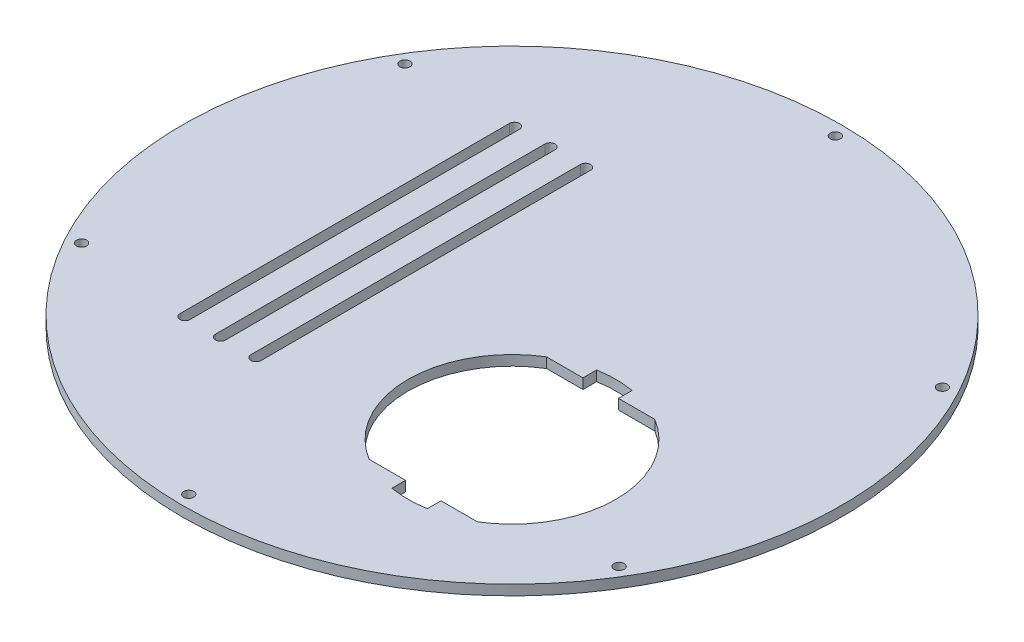
ISO-10303-21;
HEADER;
FILE_DESCRIPTION(('STEP AP214'),'2;1');
FILE_NAME('part.step','',(''),(''),'','','');
FILE_SCHEMA(('AUTOMOTIVE_DESIGN { 1 0 10303 214 1 1 1 1 }'));
ENDSEC;
DATA;
#1=APPLICATION_CONTEXT('core data for automotive mechanical design processes');
#2=APPLICATION_PROTOCOL_DEFINITION('international standard','automotive_design',2000,#1);
#3=PRODUCT_CONTEXT('',#1,'mechanical');
#4=PRODUCT('Part','Part','',(#3));
#5=PRODUCT_RELATED_PRODUCT_CATEGORY('part','',(#4));
#6=PRODUCT_DEFINITION_FORMATION('','',#4);
#7=PRODUCT_DEFINITION_CONTEXT('part definition',#1,'design');
#8=PRODUCT_DEFINITION('design','',#6,#7);
#9=PRODUCT_DEFINITION_SHAPE('','',#8);
#10=(LENGTH_UNIT() NAMED_UNIT(*) SI_UNIT(.MILLI.,.METRE.));
#11=(NAMED_UNIT(*) PLANE_ANGLE_UNIT() SI_UNIT($,.RADIAN.));
#12=(NAMED_UNIT(*) SI_UNIT($,.STERADIAN.) SOLID_ANGLE_UNIT());
#13=UNCERTAINTY_MEASURE_WITH_UNIT(LENGTH_MEASURE(1.E-05),#10,'distance_accuracy_value','');
#14=(GEOMETRIC_REPRESENTATION_CONTEXT(3) GLOBAL_UNCERTAINTY_ASSIGNED_CONTEXT((#13)) GLOBAL_UNIT_ASSIGNED_CONTEXT((#10,
#11,#12)) REPRESENTATION_CONTEXT('',''));
#15=CARTESIAN_POINT('',(0.,0.,0.));
#16=DIRECTION('',(0.,0.,1.));
#17=DIRECTION('',(1.,0.,0.));
#18=AXIS2_PLACEMENT_3D('',#15,#16,#17);
#19=CARTESIAN_POINT('',(0.,2.,0.));
#20=DIRECTION('',(0.,-1.,0.));
#21=DIRECTION('',(0.,0.,-1.));
#22=AXIS2_PLACEMENT_3D('',#19,#20,#21);
#23=CYLINDRICAL_SURFACE('',#22,65.);
#24=CARTESIAN_POINT('',(0.,2.,0.));
#25=DIRECTION('',(0.,1.,0.));
#26=DIRECTION('',(0.,0.,1.));
#27=AXIS2_PLACEMENT_3D('',#24,#25,#26);
#28=CIRCLE('',#27,65.);
#29=CARTESIAN_POINT('',(0.,2.,65.));
#30=VERTEX_POINT('',#29);
#31=EDGE_CURVE('E11',#30,#30,#28,.T.);
#32=ORIENTED_EDGE('',*,*,#31,.F.);
#33=EDGE_LOOP('',(#32));
#34=FACE_BOUND('',#33,.T.);
#35=CARTESIAN_POINT('',(0.,0.,0.));
#36=DIRECTION('',(0.,1.,0.));
#37=DIRECTION('',(0.,0.,1.));
#38=AXIS2_PLACEMENT_3D('',#35,#36,#37);
#39=CIRCLE('',#38,65.);
#40=CARTESIAN_POINT('',(0.,0.,65.));
#41=VERTEX_POINT('',#40);
#42=EDGE_CURVE('E42',#41,#41,#39,.T.);
#43=ORIENTED_EDGE('',*,*,#42,.T.);
#44=EDGE_LOOP('',(#43));
#45=FACE_BOUND('',#44,.T.);
#46=ADVANCED_FACE('F34',(#34,#45),#23,.T.);
#47=CARTESIAN_POINT('',(0.,2.,0.));
#48=DIRECTION('',(0.,1.,0.));
#49=DIRECTION('',(0.,0.,1.));
#50=AXIS2_PLACEMENT_3D('',#47,#48,#49);
#51=PLANE('',#50);
#52=DIRECTION('',(0.,0.,1.));
#53=VECTOR('',#52,1.);
#54=CARTESIAN_POINT('',(-18.9968757847677,2.,0.));
#55=LINE('',#54,#53);
#56=CARTESIAN_POINT('',(-18.9968757847677,2.,-32.5));
#57=VERTEX_POINT('',#56);
#58=CARTESIAN_POINT('',(-18.9968757847677,2.,32.5));
#59=VERTEX_POINT('',#58);
#60=EDGE_CURVE('E229',#57,#59,#55,.T.);
#61=ORIENTED_EDGE('',*,*,#60,.F.);
#62=CARTESIAN_POINT('',(-17.9968757847677,2.,-32.5));
#63=DIRECTION('',(0.,1.,0.));
#64=DIRECTION('',(0.,0.,1.));
#65=AXIS2_PLACEMENT_3D('',#62,#63,#64);
#66=CIRCLE('',#65,1.);
#67=CARTESIAN_POINT('',(-16.9968757847677,2.,-32.5));
#68=VERTEX_POINT('',#67);
#69=EDGE_CURVE('E222',#68,#57,#66,.T.);
#70=ORIENTED_EDGE('',*,*,#69,.F.);
#71=DIRECTION('',(0.,0.,1.));
#72=VECTOR('',#71,1.);
#73=CARTESIAN_POINT('',(-16.9968757847677,2.,0.));
#74=LINE('',#73,#72);
#75=CARTESIAN_POINT('',(-16.9968757847677,2.,32.5));
#76=VERTEX_POINT('',#75);
#77=EDGE_CURVE('E202',#68,#76,#74,.T.);
#78=ORIENTED_EDGE('',*,*,#77,.T.);
#79=CARTESIAN_POINT('',(-17.9968757847677,2.,32.5));
#80=DIRECTION('',(0.,1.,0.));
#81=DIRECTION('',(0.,0.,1.));
#82=AXIS2_PLACEMENT_3D('',#79,#80,#81);
#83=CIRCLE('',#82,1.);
#84=EDGE_CURVE('E227',#59,#76,#83,.T.);
#85=ORIENTED_EDGE('',*,*,#84,.F.);
#86=EDGE_LOOP('',(#61,#70,#78,#85));
#87=FACE_BOUND('',#86,.T.);
#88=DIRECTION('',(0.,0.,1.));
#89=VECTOR('',#88,1.);
#90=CARTESIAN_POINT('',(-26.,2.,0.));
#91=LINE('',#90,#89);
#92=CARTESIAN_POINT('',(-26.,2.,-32.5));
#93=VERTEX_POINT('',#92);
#94=CARTESIAN_POINT('',(-26.,2.,32.5));
#95=VERTEX_POINT('',#94);
#96=EDGE_CURVE('E258',#93,#95,#91,.T.);
#97=ORIENTED_EDGE('',*,*,#96,.F.);
#98=CARTESIAN_POINT('',(-25.,2.,-32.5));
#99=DIRECTION('',(0.,1.,0.));
#100=DIRECTION('',(0.,0.,1.));
#101=AXIS2_PLACEMENT_3D('',#98,#99,#100);
#102=CIRCLE('',#101,1.);
#103=CARTESIAN_POINT('',(-24.,2.,-32.5));
#104=VERTEX_POINT('',#103);
#105=EDGE_CURVE('E245',#104,#93,#102,.T.);
#106=ORIENTED_EDGE('',*,*,#105,.F.);
#107=DIRECTION('',(0.,0.,1.));
#108=VECTOR('',#107,1.);
#109=CARTESIAN_POINT('',(-24.,2.,0.));
#110=LINE('',#109,#108);
#111=CARTESIAN_POINT('',(-24.,2.,32.5));
#112=VERTEX_POINT('',#111);
#113=EDGE_CURVE('E253',#104,#112,#110,.T.);
#114=ORIENTED_EDGE('',*,*,#113,.T.);
#115=CARTESIAN_POINT('',(-25.,2.,32.5));
#116=DIRECTION('',(0.,1.,0.));
#117=DIRECTION('',(0.,0.,1.));
#118=AXIS2_PLACEMENT_3D('',#115,#116,#117);
#119=CIRCLE('',#118,1.);
#120=EDGE_CURVE('E256',#95,#112,#119,.T.);
#121=ORIENTED_EDGE('',*,*,#120,.F.);
#122=EDGE_LOOP('',(#97,#106,#114,#121));
#123=FACE_BOUND('',#122,.T.);
#124=DIRECTION('',(0.,0.,1.));
#125=VECTOR('',#124,1.);
#126=CARTESIAN_POINT('',(-33.0031242152323,2.,0.));
#127=LINE('',#126,#125);
#128=CARTESIAN_POINT('',(-33.0031242152323,2.,-32.5));
#129=VERTEX_POINT('',#128);
#130=CARTESIAN_POINT('',(-33.0031242152323,2.,32.5));
#131=VERTEX_POINT('',#130);
#132=EDGE_CURVE('E287',#129,#131,#127,.T.);
#133=ORIENTED_EDGE('',*,*,#132,.F.);
#134=CARTESIAN_POINT('',(-32.0031242152323,2.,-32.5));
#135=DIRECTION('',(0.,1.,0.));
#136=DIRECTION('',(0.,0.,1.));
#137=AXIS2_PLACEMENT_3D('',#134,#135,#136);
#138=CIRCLE('',#137,1.);
#139=CARTESIAN_POINT('',(-31.0031242152323,2.,-32.5));
#140=VERTEX_POINT('',#139);
#141=EDGE_CURVE('E274',#140,#129,#138,.T.);
#142=ORIENTED_EDGE('',*,*,#141,.F.);
#143=DIRECTION('',(0.,0.,1.));
#144=VECTOR('',#143,1.);
#145=CARTESIAN_POINT('',(-31.0031242152323,2.,0.));
#146=LINE('',#145,#144);
#147=CARTESIAN_POINT('',(-31.0031242152323,2.,32.5));
#148=VERTEX_POINT('',#147);
#149=EDGE_CURVE('E282',#140,#148,#146,.T.);
#150=ORIENTED_EDGE('',*,*,#149,.T.);
#151=CARTESIAN_POINT('',(-32.0031242152323,2.,32.5));
#152=DIRECTION('',(0.,1.,0.));
#153=DIRECTION('',(0.,0.,1.));
#154=AXIS2_PLACEMENT_3D('',#151,#152,#153);
#155=CIRCLE('',#154,1.);
#156=EDGE_CURVE('E285',#131,#148,#155,.T.);
#157=ORIENTED_EDGE('',*,*,#156,.F.);
#158=EDGE_LOOP('',(#133,#142,#150,#157));
#159=FACE_BOUND('',#158,.T.);
#160=DIRECTION('',(0.,0.,1.));
#161=VECTOR('',#160,1.);
#162=CARTESIAN_POINT('',(24.7132034355962,2.,0.));
#163=LINE('',#162,#161);
#164=CARTESIAN_POINT('',(24.7132034355962,2.,38.7132034355966));
#165=VERTEX_POINT('',#164);
#166=CARTESIAN_POINT('',(24.7132034355962,2.,41.4122133123208));
#167=VERTEX_POINT('',#166);
#168=EDGE_CURVE('E290',#165,#167,#163,.T.);
#169=ORIENTED_EDGE('',*,*,#168,.T.);
#170=CARTESIAN_POINT('',(21.2132034355962,2.,21.2132034355966));
#171=DIRECTION('',(0.,-1.,0.));
#172=DIRECTION('',(0.,0.,-1.));
#173=AXIS2_PLACEMENT_3D('',#170,#171,#172);
#174=CIRCLE('',#173,20.5);
#175=CARTESIAN_POINT('',(17.7132034355962,2.,41.4122133123208));
#176=VERTEX_POINT('',#175);
#177=EDGE_CURVE('E293',#167,#176,#174,.T.);
#178=ORIENTED_EDGE('',*,*,#177,.T.);
#179=DIRECTION('',(0.,0.,1.));
#180=VECTOR('',#179,1.);
#181=CARTESIAN_POINT('',(17.7132034355962,2.,0.));
#182=LINE('',#181,#180);
#183=CARTESIAN_POINT('',(17.7132034355962,2.,38.7132034355966));
#184=VERTEX_POINT('',#183);
#185=EDGE_CURVE('E297',#184,#176,#182,.T.);
#186=ORIENTED_EDGE('',*,*,#185,.F.);
#187=DIRECTION('',(-1.,0.,0.));
#188=VECTOR('',#187,1.);
#189=CARTESIAN_POINT('',(0.,2.,38.7132034355966));
#190=LINE('',#189,#188);
#191=CARTESIAN_POINT('',(10.5361251835649,2.,38.7132034355966));
#192=VERTEX_POINT('',#191);
#193=EDGE_CURVE('E300',#184,#192,#190,.T.);
#194=ORIENTED_EDGE('',*,*,#193,.T.);
#195=CARTESIAN_POINT('',(21.2132034355962,2.,21.2132034355966));
#196=DIRECTION('',(0.,-1.,0.));
#197=DIRECTION('',(0.,0.,-1.));
#198=AXIS2_PLACEMENT_3D('',#195,#196,#197);
#199=CIRCLE('',#198,20.5);
#200=CARTESIAN_POINT('',(10.5361251835649,2.,3.71320343559661));
#201=VERTEX_POINT('',#200);
#202=EDGE_CURVE('E303',#192,#201,#199,.T.);
#203=ORIENTED_EDGE('',*,*,#202,.T.);
#204=DIRECTION('',(-1.,0.,0.));
#205=VECTOR('',#204,1.);
#206=CARTESIAN_POINT('',(0.,2.,3.7132034355966));
#207=LINE('',#206,#205);
#208=CARTESIAN_POINT('',(17.7132034355962,2.,3.71320343559661));
#209=VERTEX_POINT('',#208);
#210=EDGE_CURVE('E306',#209,#201,#207,.T.);
#211=ORIENTED_EDGE('',*,*,#210,.F.);
#212=DIRECTION('',(0.,0.,-1.));
#213=VECTOR('',#212,1.);
#214=CARTESIAN_POINT('',(17.7132034355962,2.,0.));
#215=LINE('',#214,#213);
#216=CARTESIAN_POINT('',(17.7132034355962,2.,1.01419355887245));
#217=VERTEX_POINT('',#216);
#218=EDGE_CURVE('E308',#209,#217,#215,.T.);
#219=ORIENTED_EDGE('',*,*,#218,.T.);
#220=CARTESIAN_POINT('',(21.2132034355962,2.,21.2132034355966));
#221=DIRECTION('',(0.,-1.,0.));
#222=DIRECTION('',(0.,0.,-1.));
#223=AXIS2_PLACEMENT_3D('',#220,#221,#222);
#224=CIRCLE('',#223,20.5);
#225=CARTESIAN_POINT('',(24.7132034355962,2.,1.01419355887245));
#226=VERTEX_POINT('',#225);
#227=EDGE_CURVE('E311',#217,#226,#224,.T.);
#228=ORIENTED_EDGE('',*,*,#227,.T.);
#229=DIRECTION('',(0.,0.,-1.));
#230=VECTOR('',#229,1.);
#231=CARTESIAN_POINT('',(24.7132034355962,2.,0.));
#232=LINE('',#231,#230);
#233=CARTESIAN_POINT('',(24.7132034355962,2.,3.71320343559661));
#234=VERTEX_POINT('',#233);
#235=EDGE_CURVE('E314',#234,#226,#232,.T.);
#236=ORIENTED_EDGE('',*,*,#235,.F.);
#237=DIRECTION('',(1.,0.,0.));
#238=VECTOR('',#237,1.);
#239=CARTESIAN_POINT('',(0.,2.,3.71320343559661));
#240=LINE('',#239,#238);
#241=CARTESIAN_POINT('',(31.8902816876276,2.,3.71320343559661));
#242=VERTEX_POINT('',#241);
#243=EDGE_CURVE('E316',#234,#242,#240,.T.);
#244=ORIENTED_EDGE('',*,*,#243,.T.);
#245=CARTESIAN_POINT('',(21.2132034355962,2.,21.2132034355966));
#246=DIRECTION('',(0.,-1.,0.));
#247=DIRECTION('',(0.,0.,-1.));
#248=AXIS2_PLACEMENT_3D('',#245,#246,#247);
#249=CIRCLE('',#248,20.5);
#250=CARTESIAN_POINT('',(31.8902816876276,2.,38.7132034355966));
#251=VERTEX_POINT('',#250);
#252=EDGE_CURVE('E319',#242,#251,#249,.T.);
#253=ORIENTED_EDGE('',*,*,#252,.T.);
#254=DIRECTION('',(1.,0.,0.));
#255=VECTOR('',#254,1.);
#256=CARTESIAN_POINT('',(0.,2.,38.7132034355966));
#257=LINE('',#256,#255);
#258=EDGE_CURVE('E322',#165,#251,#257,.T.);
#259=ORIENTED_EDGE('',*,*,#258,.F.);
#260=EDGE_LOOP('',(#169,#178,#186,#194,#203,#211,#219,#228,#236,#244,#253,#259));
#261=FACE_BOUND('',#260,.T.);
#262=CARTESIAN_POINT('',(1.27880200091845,2.,-62.4869159540015));
#263=DIRECTION('',(0.,1.,0.));
#264=DIRECTION('',(0.,0.,1.));
#265=AXIS2_PLACEMENT_3D('',#262,#263,#264);
#266=CIRCLE('',#265,1.);
#267=CARTESIAN_POINT('',(1.27880200091845,2.,-61.4869159540015));
#268=VERTEX_POINT('',#267);
#269=EDGE_CURVE('E360',#268,#268,#266,.T.);
#270=ORIENTED_EDGE('',*,*,#269,.F.);
#271=EDGE_LOOP('',(#270));
#272=FACE_BOUND('',#271,.T.);
#273=CARTESIAN_POINT('',(54.7546576207677,2.,-30.135982957795));
#274=DIRECTION('',(0.,1.,0.));
#275=DIRECTION('',(0.,0.,1.));
#276=AXIS2_PLACEMENT_3D('',#273,#274,#275);
#277=CIRCLE('',#276,0.999999999999998);
#278=CARTESIAN_POINT('',(54.7546576207677,2.,-29.135982957795));
#279=VERTEX_POINT('',#278);
#280=EDGE_CURVE('E385',#279,#279,#277,.T.);
#281=ORIENTED_EDGE('',*,*,#280,.F.);
#282=EDGE_LOOP('',(#281));
#283=FACE_BOUND('',#282,.T.);
#284=CARTESIAN_POINT('',(53.4758556198492,2.,32.3509329962065));
#285=DIRECTION('',(0.,1.,0.));
#286=DIRECTION('',(0.,0.,1.));
#287=AXIS2_PLACEMENT_3D('',#284,#285,#286);
#288=CIRCLE('',#287,0.999999999999998);
#289=CARTESIAN_POINT('',(53.4758556198492,2.,33.3509329962065));
#290=VERTEX_POINT('',#289);
#291=EDGE_CURVE('E389',#290,#290,#288,.T.);
#292=ORIENTED_EDGE('',*,*,#291,.F.);
#293=EDGE_LOOP('',(#292));
#294=FACE_BOUND('',#293,.T.);
#295=CARTESIAN_POINT('',(-1.27880200091843,2.,62.4869159540015));
#296=DIRECTION('',(0.,1.,0.));
#297=DIRECTION('',(0.,0.,1.));
#298=AXIS2_PLACEMENT_3D('',#295,#296,#297);
#299=CIRCLE('',#298,1.);
#300=CARTESIAN_POINT('',(-1.27880200091843,2.,63.4869159540015));
#301=VERTEX_POINT('',#300);
#302=EDGE_CURVE('E393',#301,#301,#299,.T.);
#303=ORIENTED_EDGE('',*,*,#302,.F.);
#304=EDGE_LOOP('',(#303));
#305=FACE_BOUND('',#304,.T.);
#306=CARTESIAN_POINT('',(-54.7546576207676,2.,30.135982957795));
#307=DIRECTION('',(0.,1.,0.));
#308=DIRECTION('',(0.,0.,1.));
#309=AXIS2_PLACEMENT_3D('',#306,#307,#308);
#310=CIRCLE('',#309,0.999999999999998);
#311=CARTESIAN_POINT('',(-54.7546576207676,2.,31.135982957795));
#312=VERTEX_POINT('',#311);
#313=EDGE_CURVE('E397',#312,#312,#310,.T.);
#314=ORIENTED_EDGE('',*,*,#313,.F.);
#315=EDGE_LOOP('',(#314));
#316=FACE_BOUND('',#315,.T.);
#317=CARTESIAN_POINT('',(-53.4758556198492,2.,-32.3509329962065));
#318=DIRECTION('',(0.,1.,0.));
#319=DIRECTION('',(0.,0.,1.));
#320=AXIS2_PLACEMENT_3D('',#317,#318,#319);
#321=CIRCLE('',#320,0.999999999999998);
#322=CARTESIAN_POINT('',(-53.4758556198492,2.,-31.3509329962065));
#323=VERTEX_POINT('',#322);
#324=EDGE_CURVE('E401',#323,#323,#321,.T.);
#325=ORIENTED_EDGE('',*,*,#324,.F.);
#326=EDGE_LOOP('',(#325));
#327=FACE_BOUND('',#326,.T.);
#328=ORIENTED_EDGE('',*,*,#31,.T.);
#329=EDGE_LOOP('',(#328));
#330=FACE_BOUND('',#329,.T.);
#331=ADVANCED_FACE('F436',(#87,#123,#159,#261,#272,#283,#294,#305,#316,#327,#330),#51,.T.);
#332=CARTESIAN_POINT('',(0.,0.,0.));
#333=DIRECTION('',(0.,1.,0.));
#334=DIRECTION('',(0.,0.,1.));
#335=AXIS2_PLACEMENT_3D('',#332,#333,#334);
#336=PLANE('',#335);
#337=CARTESIAN_POINT('',(-17.9968757847677,0.,-32.5));
#338=DIRECTION('',(0.,-1.,0.));
#339=DIRECTION('',(0.,0.,-1.));
#340=AXIS2_PLACEMENT_3D('',#337,#338,#339);
#341=CIRCLE('',#340,1.);
#342=CARTESIAN_POINT('',(-18.9968757847677,0.,-32.5));
#343=VERTEX_POINT('',#342);
#344=CARTESIAN_POINT('',(-16.9968757847677,0.,-32.5));
#345=VERTEX_POINT('',#344);
#346=EDGE_CURVE('E208',#343,#345,#341,.T.);
#347=ORIENTED_EDGE('',*,*,#346,.F.);
#348=DIRECTION('',(0.,0.,-1.));
#349=VECTOR('',#348,1.);
#350=CARTESIAN_POINT('',(-18.9968757847677,0.,0.));
#351=LINE('',#350,#349);
#352=CARTESIAN_POINT('',(-18.9968757847677,0.,32.5));
#353=VERTEX_POINT('',#352);
#354=EDGE_CURVE('E58',#353,#343,#351,.T.);
#355=ORIENTED_EDGE('',*,*,#354,.F.);
#356=CARTESIAN_POINT('',(-17.9968757847677,0.,32.5));
#357=DIRECTION('',(0.,-1.,0.));
#358=DIRECTION('',(0.,0.,-1.));
#359=AXIS2_PLACEMENT_3D('',#356,#357,#358);
#360=CIRCLE('',#359,1.);
#361=CARTESIAN_POINT('',(-16.9968757847677,0.,32.5));
#362=VERTEX_POINT('',#361);
#363=EDGE_CURVE('E215',#362,#353,#360,.T.);
#364=ORIENTED_EDGE('',*,*,#363,.F.);
#365=DIRECTION('',(0.,0.,-1.));
#366=VECTOR('',#365,1.);
#367=CARTESIAN_POINT('',(-16.9968757847677,0.,0.));
#368=LINE('',#367,#366);
#369=EDGE_CURVE('E199',#362,#345,#368,.T.);
#370=ORIENTED_EDGE('',*,*,#369,.T.);
#371=EDGE_LOOP('',(#347,#355,#364,#370));
#372=FACE_BOUND('',#371,.T.);
#373=CARTESIAN_POINT('',(-25.,0.,-32.5));
#374=DIRECTION('',(0.,-1.,0.));
#375=DIRECTION('',(0.,0.,-1.));
#376=AXIS2_PLACEMENT_3D('',#373,#374,#375);
#377=CIRCLE('',#376,1.);
#378=CARTESIAN_POINT('',(-26.,0.,-32.5));
#379=VERTEX_POINT('',#378);
#380=CARTESIAN_POINT('',(-24.,0.,-32.5));
#381=VERTEX_POINT('',#380);
#382=EDGE_CURVE('E233',#379,#381,#377,.T.);
#383=ORIENTED_EDGE('',*,*,#382,.F.);
#384=DIRECTION('',(0.,0.,-1.));
#385=VECTOR('',#384,1.);
#386=CARTESIAN_POINT('',(-26.,0.,0.));
#387=LINE('',#386,#385);
#388=CARTESIAN_POINT('',(-26.,0.,32.5));
#389=VERTEX_POINT('',#388);
#390=EDGE_CURVE('E231',#389,#379,#387,.T.);
#391=ORIENTED_EDGE('',*,*,#390,.F.);
#392=CARTESIAN_POINT('',(-25.,0.,32.5));
#393=DIRECTION('',(0.,-1.,0.));
#394=DIRECTION('',(0.,0.,-1.));
#395=AXIS2_PLACEMENT_3D('',#392,#393,#394);
#396=CIRCLE('',#395,1.);
#397=CARTESIAN_POINT('',(-24.,0.,32.5));
#398=VERTEX_POINT('',#397);
#399=EDGE_CURVE('E239',#398,#389,#396,.T.);
#400=ORIENTED_EDGE('',*,*,#399,.F.);
#401=DIRECTION('',(0.,0.,-1.));
#402=VECTOR('',#401,1.);
#403=CARTESIAN_POINT('',(-24.,0.,0.));
#404=LINE('',#403,#402);
#405=EDGE_CURVE('E236',#398,#381,#404,.T.);
#406=ORIENTED_EDGE('',*,*,#405,.T.);
#407=EDGE_LOOP('',(#383,#391,#400,#406));
#408=FACE_BOUND('',#407,.T.);
#409=CARTESIAN_POINT('',(-32.0031242152323,0.,-32.5));
#410=DIRECTION('',(0.,-1.,0.));
#411=DIRECTION('',(0.,0.,-1.));
#412=AXIS2_PLACEMENT_3D('',#409,#410,#411);
#413=CIRCLE('',#412,1.);
#414=CARTESIAN_POINT('',(-33.0031242152323,0.,-32.5));
#415=VERTEX_POINT('',#414);
#416=CARTESIAN_POINT('',(-31.0031242152323,0.,-32.5));
#417=VERTEX_POINT('',#416);
#418=EDGE_CURVE('E262',#415,#417,#413,.T.);
#419=ORIENTED_EDGE('',*,*,#418,.F.);
#420=DIRECTION('',(0.,0.,-1.));
#421=VECTOR('',#420,1.);
#422=CARTESIAN_POINT('',(-33.0031242152323,0.,0.));
#423=LINE('',#422,#421);
#424=CARTESIAN_POINT('',(-33.0031242152323,0.,32.5));
#425=VERTEX_POINT('',#424);
#426=EDGE_CURVE('E260',#425,#415,#423,.T.);
#427=ORIENTED_EDGE('',*,*,#426,.F.);
#428=CARTESIAN_POINT('',(-32.0031242152323,0.,32.5));
#429=DIRECTION('',(0.,-1.,0.));
#430=DIRECTION('',(0.,0.,-1.));
#431=AXIS2_PLACEMENT_3D('',#428,#429,#430);
#432=CIRCLE('',#431,1.);
#433=CARTESIAN_POINT('',(-31.0031242152323,0.,32.5));
#434=VERTEX_POINT('',#433);
#435=EDGE_CURVE('E268',#434,#425,#432,.T.);
#436=ORIENTED_EDGE('',*,*,#435,.F.);
#437=DIRECTION('',(0.,0.,-1.));
#438=VECTOR('',#437,1.);
#439=CARTESIAN_POINT('',(-31.0031242152323,0.,0.));
#440=LINE('',#439,#438);
#441=EDGE_CURVE('E265',#434,#417,#440,.T.);
#442=ORIENTED_EDGE('',*,*,#441,.T.);
#443=EDGE_LOOP('',(#419,#427,#436,#442));
#444=FACE_BOUND('',#443,.T.);
#445=CARTESIAN_POINT('',(21.2132034355962,0.,21.2132034355966));
#446=DIRECTION('',(0.,-1.,0.));
#447=DIRECTION('',(0.,0.,-1.));
#448=AXIS2_PLACEMENT_3D('',#445,#446,#447);
#449=CIRCLE('',#448,20.5);
#450=CARTESIAN_POINT('',(24.7132034355962,0.,41.4122133123208));
#451=VERTEX_POINT('',#450);
#452=CARTESIAN_POINT('',(17.7132034355962,0.,41.4122133123208));
#453=VERTEX_POINT('',#452);
#454=EDGE_CURVE('E326',#451,#453,#449,.T.);
#455=ORIENTED_EDGE('',*,*,#454,.F.);
#456=DIRECTION('',(0.,0.,1.));
#457=VECTOR('',#456,1.);
#458=CARTESIAN_POINT('',(24.7132034355962,0.,0.));
#459=LINE('',#458,#457);
#460=CARTESIAN_POINT('',(24.7132034355962,0.,38.7132034355966));
#461=VERTEX_POINT('',#460);
#462=EDGE_CURVE('E289',#461,#451,#459,.T.);
#463=ORIENTED_EDGE('',*,*,#462,.F.);
#464=DIRECTION('',(1.,0.,0.));
#465=VECTOR('',#464,1.);
#466=CARTESIAN_POINT('',(0.,0.,38.7132034355966));
#467=LINE('',#466,#465);
#468=CARTESIAN_POINT('',(31.8902816876276,0.,38.7132034355966));
#469=VERTEX_POINT('',#468);
#470=EDGE_CURVE('E294',#461,#469,#467,.T.);
#471=ORIENTED_EDGE('',*,*,#470,.T.);
#472=CARTESIAN_POINT('',(21.2132034355962,0.,21.2132034355966));
#473=DIRECTION('',(0.,-1.,0.));
#474=DIRECTION('',(0.,0.,-1.));
#475=AXIS2_PLACEMENT_3D('',#472,#473,#474);
#476=CIRCLE('',#475,20.5);
#477=CARTESIAN_POINT('',(31.8902816876276,0.,3.71320343559661));
#478=VERTEX_POINT('',#477);
#479=EDGE_CURVE('E353',#478,#469,#476,.T.);
#480=ORIENTED_EDGE('',*,*,#479,.F.);
#481=DIRECTION('',(1.,0.,0.));
#482=VECTOR('',#481,1.);
#483=CARTESIAN_POINT('',(0.,0.,3.71320343559661));
#484=LINE('',#483,#482);
#485=CARTESIAN_POINT('',(24.7132034355962,0.,3.71320343559661));
#486=VERTEX_POINT('',#485);
#487=EDGE_CURVE('E350',#486,#478,#484,.T.);
#488=ORIENTED_EDGE('',*,*,#487,.F.);
#489=DIRECTION('',(0.,0.,-1.));
#490=VECTOR('',#489,1.);
#491=CARTESIAN_POINT('',(24.7132034355962,0.,0.));
#492=LINE('',#491,#490);
#493=CARTESIAN_POINT('',(24.7132034355962,0.,1.01419355887245));
#494=VERTEX_POINT('',#493);
#495=EDGE_CURVE('E347',#486,#494,#492,.T.);
#496=ORIENTED_EDGE('',*,*,#495,.T.);
#497=CARTESIAN_POINT('',(21.2132034355962,0.,21.2132034355966));
#498=DIRECTION('',(0.,-1.,0.));
#499=DIRECTION('',(0.,0.,-1.));
#500=AXIS2_PLACEMENT_3D('',#497,#498,#499);
#501=CIRCLE('',#500,20.5);
#502=CARTESIAN_POINT('',(17.7132034355962,0.,1.01419355887245));
#503=VERTEX_POINT('',#502);
#504=EDGE_CURVE('E344',#503,#494,#501,.T.);
#505=ORIENTED_EDGE('',*,*,#504,.F.);
#506=DIRECTION('',(0.,0.,-1.));
#507=VECTOR('',#506,1.);
#508=CARTESIAN_POINT('',(17.7132034355962,0.,0.));
#509=LINE('',#508,#507);
#510=CARTESIAN_POINT('',(17.7132034355962,0.,3.71320343559661));
#511=VERTEX_POINT('',#510);
#512=EDGE_CURVE('E341',#511,#503,#509,.T.);
#513=ORIENTED_EDGE('',*,*,#512,.F.);
#514=DIRECTION('',(-1.,0.,0.));
#515=VECTOR('',#514,1.);
#516=CARTESIAN_POINT('',(0.,0.,3.7132034355966));
#517=LINE('',#516,#515);
#518=CARTESIAN_POINT('',(10.5361251835649,0.,3.71320343559661));
#519=VERTEX_POINT('',#518);
#520=EDGE_CURVE('E338',#511,#519,#517,.T.);
#521=ORIENTED_EDGE('',*,*,#520,.T.);
#522=CARTESIAN_POINT('',(21.2132034355962,0.,21.2132034355966));
#523=DIRECTION('',(0.,-1.,0.));
#524=DIRECTION('',(0.,0.,-1.));
#525=AXIS2_PLACEMENT_3D('',#522,#523,#524);
#526=CIRCLE('',#525,20.5);
#527=CARTESIAN_POINT('',(10.5361251835649,0.,38.7132034355966));
#528=VERTEX_POINT('',#527);
#529=EDGE_CURVE('E335',#528,#519,#526,.T.);
#530=ORIENTED_EDGE('',*,*,#529,.F.);
#531=DIRECTION('',(-1.,0.,0.));
#532=VECTOR('',#531,1.);
#533=CARTESIAN_POINT('',(0.,0.,38.7132034355966));
#534=LINE('',#533,#532);
#535=CARTESIAN_POINT('',(17.7132034355962,0.,38.7132034355966));
#536=VERTEX_POINT('',#535);
#537=EDGE_CURVE('E332',#536,#528,#534,.T.);
#538=ORIENTED_EDGE('',*,*,#537,.F.);
#539=DIRECTION('',(0.,0.,1.));
#540=VECTOR('',#539,1.);
#541=CARTESIAN_POINT('',(17.7132034355962,0.,0.));
#542=LINE('',#541,#540);
#543=EDGE_CURVE('E329',#536,#453,#542,.T.);
#544=ORIENTED_EDGE('',*,*,#543,.T.);
#545=EDGE_LOOP('',(#455,#463,#471,#480,#488,#496,#505,#513,#521,#530,#538,#544));
#546=FACE_BOUND('',#545,.T.);
#547=CARTESIAN_POINT('',(1.27880200091845,0.,-62.4869159540015));
#548=DIRECTION('',(0.,1.,0.));
#549=DIRECTION('',(0.,0.,1.));
#550=AXIS2_PLACEMENT_3D('',#547,#548,#549);
#551=CIRCLE('',#550,1.);
#552=CARTESIAN_POINT('',(1.27880200091845,0.,-61.4869159540015));
#553=VERTEX_POINT('',#552);
#554=EDGE_CURVE('E37',#553,#553,#551,.T.);
#555=ORIENTED_EDGE('',*,*,#554,.T.);
#556=EDGE_LOOP('',(#555));
#557=FACE_BOUND('',#556,.T.);
#558=CARTESIAN_POINT('',(54.7546576207677,0.,-30.135982957795));
#559=DIRECTION('',(0.,1.,0.));
#560=DIRECTION('',(0.,0.,1.));
#561=AXIS2_PLACEMENT_3D('',#558,#559,#560);
#562=CIRCLE('',#561,0.999999999999998);
#563=CARTESIAN_POINT('',(54.7546576207677,0.,-29.135982957795));
#564=VERTEX_POINT('',#563);
#565=EDGE_CURVE('E388',#564,#564,#562,.T.);
#566=ORIENTED_EDGE('',*,*,#565,.T.);
#567=EDGE_LOOP('',(#566));
#568=FACE_BOUND('',#567,.T.);
#569=CARTESIAN_POINT('',(53.4758556198492,0.,32.3509329962065));
#570=DIRECTION('',(0.,1.,0.));
#571=DIRECTION('',(0.,0.,1.));
#572=AXIS2_PLACEMENT_3D('',#569,#570,#571);
#573=CIRCLE('',#572,0.999999999999998);
#574=CARTESIAN_POINT('',(53.4758556198492,0.,33.3509329962065));
#575=VERTEX_POINT('',#574);
#576=EDGE_CURVE('E392',#575,#575,#573,.T.);
#577=ORIENTED_EDGE('',*,*,#576,.T.);
#578=EDGE_LOOP('',(#577));
#579=FACE_BOUND('',#578,.T.);
#580=CARTESIAN_POINT('',(-1.27880200091843,0.,62.4869159540015));
#581=DIRECTION('',(0.,1.,0.));
#582=DIRECTION('',(0.,0.,1.));
#583=AXIS2_PLACEMENT_3D('',#580,#581,#582);
#584=CIRCLE('',#583,1.);
#585=CARTESIAN_POINT('',(-1.27880200091843,0.,63.4869159540015));
#586=VERTEX_POINT('',#585);
#587=EDGE_CURVE('E396',#586,#586,#584,.T.);
#588=ORIENTED_EDGE('',*,*,#587,.T.);
#589=EDGE_LOOP('',(#588));
#590=FACE_BOUND('',#589,.T.);
#591=CARTESIAN_POINT('',(-54.7546576207676,0.,30.135982957795));
#592=DIRECTION('',(0.,1.,0.));
#593=DIRECTION('',(0.,0.,1.));
#594=AXIS2_PLACEMENT_3D('',#591,#592,#593);
#595=CIRCLE('',#594,0.999999999999998);
#596=CARTESIAN_POINT('',(-54.7546576207676,0.,31.135982957795));
#597=VERTEX_POINT('',#596);
#598=EDGE_CURVE('E400',#597,#597,#595,.T.);
#599=ORIENTED_EDGE('',*,*,#598,.T.);
#600=EDGE_LOOP('',(#599));
#601=FACE_BOUND('',#600,.T.);
#602=CARTESIAN_POINT('',(-53.4758556198492,0.,-32.3509329962065));
#603=DIRECTION('',(0.,1.,0.));
#604=DIRECTION('',(0.,0.,1.));
#605=AXIS2_PLACEMENT_3D('',#602,#603,#604);
#606=CIRCLE('',#605,0.999999999999998);
#607=CARTESIAN_POINT('',(-53.4758556198492,0.,-31.3509329962065));
#608=VERTEX_POINT('',#607);
#609=EDGE_CURVE('E403',#608,#608,#606,.T.);
#610=ORIENTED_EDGE('',*,*,#609,.T.);
#611=EDGE_LOOP('',(#610));
#612=FACE_BOUND('',#611,.T.);
#613=ORIENTED_EDGE('',*,*,#42,.F.);
#614=EDGE_LOOP('',(#613));
#615=FACE_BOUND('',#614,.T.);
#616=ADVANCED_FACE('F212',(#372,#408,#444,#546,#557,#568,#579,#590,#601,#612,#615),#336,.F.);
#617=CARTESIAN_POINT('',(-53.4758556198492,-1.,-32.3509329962065));
#618=DIRECTION('',(0.,1.,0.));
#619=DIRECTION('',(0.,0.,1.));
#620=AXIS2_PLACEMENT_3D('',#617,#618,#619);
#621=CYLINDRICAL_SURFACE('',#620,0.999999999999998);
#622=ORIENTED_EDGE('',*,*,#324,.T.);
#623=EDGE_LOOP('',(#622));
#624=FACE_BOUND('',#623,.T.);
#625=ORIENTED_EDGE('',*,*,#609,.F.);
#626=EDGE_LOOP('',(#625));
#627=FACE_BOUND('',#626,.T.);
#628=ADVANCED_FACE('F448',(#624,#627),#621,.F.);
#629=CARTESIAN_POINT('',(-54.7546576207676,-1.,30.135982957795));
#630=DIRECTION('',(0.,1.,0.));
#631=DIRECTION('',(0.,0.,1.));
#632=AXIS2_PLACEMENT_3D('',#629,#630,#631);
#633=CYLINDRICAL_SURFACE('',#632,0.999999999999998);
#634=ORIENTED_EDGE('',*,*,#313,.T.);
#635=EDGE_LOOP('',(#634));
#636=FACE_BOUND('',#635,.T.);
#637=ORIENTED_EDGE('',*,*,#598,.F.);
#638=EDGE_LOOP('',(#637));
#639=FACE_BOUND('',#638,.T.);
#640=ADVANCED_FACE('F452',(#636,#639),#633,.F.);
#641=CARTESIAN_POINT('',(-1.27880200091843,-1.,62.4869159540015));
#642=DIRECTION('',(0.,1.,0.));
#643=DIRECTION('',(0.,0.,1.));
#644=AXIS2_PLACEMENT_3D('',#641,#642,#643);
#645=CYLINDRICAL_SURFACE('',#644,1.);
#646=ORIENTED_EDGE('',*,*,#302,.T.);
#647=EDGE_LOOP('',(#646));
#648=FACE_BOUND('',#647,.T.);
#649=ORIENTED_EDGE('',*,*,#587,.F.);
#650=EDGE_LOOP('',(#649));
#651=FACE_BOUND('',#650,.T.);
#652=ADVANCED_FACE('F432',(#648,#651),#645,.F.);
#653=CARTESIAN_POINT('',(53.4758556198492,-1.,32.3509329962065));
#654=DIRECTION('',(0.,1.,0.));
#655=DIRECTION('',(0.,0.,1.));
#656=AXIS2_PLACEMENT_3D('',#653,#654,#655);
#657=CYLINDRICAL_SURFACE('',#656,0.999999999999998);
#658=ORIENTED_EDGE('',*,*,#291,.T.);
#659=EDGE_LOOP('',(#658));
#660=FACE_BOUND('',#659,.T.);
#661=ORIENTED_EDGE('',*,*,#576,.F.);
#662=EDGE_LOOP('',(#661));
#663=FACE_BOUND('',#662,.T.);
#664=ADVANCED_FACE('F422',(#660,#663),#657,.F.);
#665=CARTESIAN_POINT('',(54.7546576207677,-1.,-30.135982957795));
#666=DIRECTION('',(0.,1.,0.));
#667=DIRECTION('',(0.,0.,1.));
#668=AXIS2_PLACEMENT_3D('',#665,#666,#667);
#669=CYLINDRICAL_SURFACE('',#668,0.999999999999998);
#670=ORIENTED_EDGE('',*,*,#280,.T.);
#671=EDGE_LOOP('',(#670));
#672=FACE_BOUND('',#671,.T.);
#673=ORIENTED_EDGE('',*,*,#565,.F.);
#674=EDGE_LOOP('',(#673));
#675=FACE_BOUND('',#674,.T.);
#676=ADVANCED_FACE('F419',(#672,#675),#669,.F.);
#677=CARTESIAN_POINT('',(1.27880200091845,-1.,-62.4869159540015));
#678=DIRECTION('',(0.,1.,0.));
#679=DIRECTION('',(0.,0.,1.));
#680=AXIS2_PLACEMENT_3D('',#677,#678,#679);
#681=CYLINDRICAL_SURFACE('',#680,1.);
#682=ORIENTED_EDGE('',*,*,#269,.T.);
#683=EDGE_LOOP('',(#682));
#684=FACE_BOUND('',#683,.T.);
#685=ORIENTED_EDGE('',*,*,#554,.F.);
#686=EDGE_LOOP('',(#685));
#687=FACE_BOUND('',#686,.T.);
#688=ADVANCED_FACE('F421',(#684,#687),#681,.F.);
#689=CARTESIAN_POINT('',(24.7132034355962,2.,0.));
#690=DIRECTION('',(1.,0.,0.));
#691=DIRECTION('',(0.,0.,-1.));
#692=AXIS2_PLACEMENT_3D('',#689,#690,#691);
#693=PLANE('',#692);
#694=ORIENTED_EDGE('',*,*,#462,.T.);
#695=DIRECTION('',(0.,-1.,0.));
#696=VECTOR('',#695,1.);
#697=CARTESIAN_POINT('',(24.7132034355962,2.,41.4122133123208));
#698=LINE('',#697,#696);
#699=EDGE_CURVE('E324',#167,#451,#698,.T.);
#700=ORIENTED_EDGE('',*,*,#699,.F.);
#701=ORIENTED_EDGE('',*,*,#168,.F.);
#702=DIRECTION('',(0.,-1.,0.));
#703=VECTOR('',#702,1.);
#704=CARTESIAN_POINT('',(24.7132034355962,2.,38.7132034355966));
#705=LINE('',#704,#703);
#706=EDGE_CURVE('E358',#165,#461,#705,.T.);
#707=ORIENTED_EDGE('',*,*,#706,.T.);
#708=EDGE_LOOP('',(#694,#700,#701,#707));
#709=FACE_BOUND('',#708,.T.);
#710=ADVANCED_FACE('F429',(#709),#693,.F.);
#711=CARTESIAN_POINT('',(0.,2.,38.7132034355966));
#712=DIRECTION('',(0.,0.,-1.));
#713=DIRECTION('',(-1.,0.,0.));
#714=AXIS2_PLACEMENT_3D('',#711,#712,#713);
#715=PLANE('',#714);
#716=ORIENTED_EDGE('',*,*,#470,.F.);
#717=ORIENTED_EDGE('',*,*,#706,.F.);
#718=ORIENTED_EDGE('',*,*,#258,.T.);
#719=DIRECTION('',(0.,-1.,0.));
#720=VECTOR('',#719,1.);
#721=CARTESIAN_POINT('',(31.8902816876276,2.,38.7132034355966));
#722=LINE('',#721,#720);
#723=EDGE_CURVE('E361',#251,#469,#722,.T.);
#724=ORIENTED_EDGE('',*,*,#723,.T.);
#725=EDGE_LOOP('',(#716,#717,#718,#724));
#726=FACE_BOUND('',#725,.T.);
#727=ADVANCED_FACE('F505',(#726),#715,.T.);
#728=CARTESIAN_POINT('',(21.2132034355962,2.,21.2132034355966));
#729=DIRECTION('',(0.,-1.,0.));
#730=DIRECTION('',(0.,0.,-1.));
#731=AXIS2_PLACEMENT_3D('',#728,#729,#730);
#732=CYLINDRICAL_SURFACE('',#731,20.5);
#733=ORIENTED_EDGE('',*,*,#479,.T.);
#734=ORIENTED_EDGE('',*,*,#723,.F.);
#735=ORIENTED_EDGE('',*,*,#252,.F.);
#736=DIRECTION('',(0.,-1.,0.));
#737=VECTOR('',#736,1.);
#738=CARTESIAN_POINT('',(31.8902816876276,2.,3.71320343559661));
#739=LINE('',#738,#737);
#740=EDGE_CURVE('E363',#242,#478,#739,.T.);
#741=ORIENTED_EDGE('',*,*,#740,.T.);
#742=EDGE_LOOP('',(#733,#734,#735,#741));
#743=FACE_BOUND('',#742,.T.);
#744=ADVANCED_FACE('F517',(#743),#732,.F.);
#745=CARTESIAN_POINT('',(0.,2.,3.71320343559661));
#746=DIRECTION('',(0.,0.,-1.));
#747=DIRECTION('',(-1.,0.,0.));
#748=AXIS2_PLACEMENT_3D('',#745,#746,#747);
#749=PLANE('',#748);
#750=ORIENTED_EDGE('',*,*,#487,.T.);
#751=ORIENTED_EDGE('',*,*,#740,.F.);
#752=ORIENTED_EDGE('',*,*,#243,.F.);
#753=DIRECTION('',(0.,-1.,0.));
#754=VECTOR('',#753,1.);
#755=CARTESIAN_POINT('',(24.7132034355962,2.,3.71320343559661));
#756=LINE('',#755,#754);
#757=EDGE_CURVE('E365',#234,#486,#756,.T.);
#758=ORIENTED_EDGE('',*,*,#757,.T.);
#759=EDGE_LOOP('',(#750,#751,#752,#758));
#760=FACE_BOUND('',#759,.T.);
#761=ADVANCED_FACE('F527',(#760),#749,.F.);
#762=CARTESIAN_POINT('',(24.7132034355962,2.,0.));
#763=DIRECTION('',(-1.,0.,0.));
#764=DIRECTION('',(0.,0.,1.));
#765=AXIS2_PLACEMENT_3D('',#762,#763,#764);
#766=PLANE('',#765);
#767=ORIENTED_EDGE('',*,*,#495,.F.);
#768=ORIENTED_EDGE('',*,*,#757,.F.);
#769=ORIENTED_EDGE('',*,*,#235,.T.);
#770=DIRECTION('',(0.,-1.,0.));
#771=VECTOR('',#770,1.);
#772=CARTESIAN_POINT('',(24.7132034355962,2.,1.01419355887245));
#773=LINE('',#772,#771);
#774=EDGE_CURVE('E367',#226,#494,#773,.T.);
#775=ORIENTED_EDGE('',*,*,#774,.T.);
#776=EDGE_LOOP('',(#767,#768,#769,#775));
#777=FACE_BOUND('',#776,.T.);
#778=ADVANCED_FACE('F538',(#777),#766,.T.);
#779=CARTESIAN_POINT('',(21.2132034355962,2.,21.2132034355966));
#780=DIRECTION('',(0.,-1.,0.));
#781=DIRECTION('',(0.,0.,-1.));
#782=AXIS2_PLACEMENT_3D('',#779,#780,#781);
#783=CYLINDRICAL_SURFACE('',#782,20.5);
#784=ORIENTED_EDGE('',*,*,#504,.T.);
#785=ORIENTED_EDGE('',*,*,#774,.F.);
#786=ORIENTED_EDGE('',*,*,#227,.F.);
#787=DIRECTION('',(0.,-1.,0.));
#788=VECTOR('',#787,1.);
#789=CARTESIAN_POINT('',(17.7132034355962,2.,1.01419355887245));
#790=LINE('',#789,#788);
#791=EDGE_CURVE('E369',#217,#503,#790,.T.);
#792=ORIENTED_EDGE('',*,*,#791,.T.);
#793=EDGE_LOOP('',(#784,#785,#786,#792));
#794=FACE_BOUND('',#793,.T.);
#795=ADVANCED_FACE('F548',(#794),#783,.F.);
#796=CARTESIAN_POINT('',(17.7132034355962,2.,0.));
#797=DIRECTION('',(-1.,0.,0.));
#798=DIRECTION('',(0.,0.,1.));
#799=AXIS2_PLACEMENT_3D('',#796,#797,#798);
#800=PLANE('',#799);
#801=ORIENTED_EDGE('',*,*,#512,.T.);
#802=ORIENTED_EDGE('',*,*,#791,.F.);
#803=ORIENTED_EDGE('',*,*,#218,.F.);
#804=DIRECTION('',(0.,-1.,0.));
#805=VECTOR('',#804,1.);
#806=CARTESIAN_POINT('',(17.7132034355962,2.,3.71320343559661));
#807=LINE('',#806,#805);
#808=EDGE_CURVE('E371',#209,#511,#807,.T.);
#809=ORIENTED_EDGE('',*,*,#808,.T.);
#810=EDGE_LOOP('',(#801,#802,#803,#809));
#811=FACE_BOUND('',#810,.T.);
#812=ADVANCED_FACE('F558',(#811),#800,.F.);
#813=CARTESIAN_POINT('',(0.,2.,3.7132034355966));
#814=DIRECTION('',(0.,0.,1.));
#815=DIRECTION('',(1.,0.,0.));
#816=AXIS2_PLACEMENT_3D('',#813,#814,#815);
#817=PLANE('',#816);
#818=ORIENTED_EDGE('',*,*,#520,.F.);
#819=ORIENTED_EDGE('',*,*,#808,.F.);
#820=ORIENTED_EDGE('',*,*,#210,.T.);
#821=DIRECTION('',(0.,-1.,0.));
#822=VECTOR('',#821,1.);
#823=CARTESIAN_POINT('',(10.5361251835649,2.,3.71320343559661));
#824=LINE('',#823,#822);
#825=EDGE_CURVE('E373',#201,#519,#824,.T.);
#826=ORIENTED_EDGE('',*,*,#825,.T.);
#827=EDGE_LOOP('',(#818,#819,#820,#826));
#828=FACE_BOUND('',#827,.T.);
#829=ADVANCED_FACE('F568',(#828),#817,.T.);
#830=CARTESIAN_POINT('',(21.2132034355962,2.,21.2132034355966));
#831=DIRECTION('',(0.,-1.,0.));
#832=DIRECTION('',(0.,0.,-1.));
#833=AXIS2_PLACEMENT_3D('',#830,#831,#832);
#834=CYLINDRICAL_SURFACE('',#833,20.5);
#835=ORIENTED_EDGE('',*,*,#529,.T.);
#836=ORIENTED_EDGE('',*,*,#825,.F.);
#837=ORIENTED_EDGE('',*,*,#202,.F.);
#838=DIRECTION('',(0.,-1.,0.));
#839=VECTOR('',#838,1.);
#840=CARTESIAN_POINT('',(10.5361251835649,2.,38.7132034355966));
#841=LINE('',#840,#839);
#842=EDGE_CURVE('E375',#192,#528,#841,.T.);
#843=ORIENTED_EDGE('',*,*,#842,.T.);
#844=EDGE_LOOP('',(#835,#836,#837,#843));
#845=FACE_BOUND('',#844,.T.);
#846=ADVANCED_FACE('F579',(#845),#834,.F.);
#847=CARTESIAN_POINT('',(0.,2.,38.7132034355966));
#848=DIRECTION('',(0.,0.,1.));
#849=DIRECTION('',(1.,0.,0.));
#850=AXIS2_PLACEMENT_3D('',#847,#848,#849);
#851=PLANE('',#850);
#852=ORIENTED_EDGE('',*,*,#537,.T.);
#853=ORIENTED_EDGE('',*,*,#842,.F.);
#854=ORIENTED_EDGE('',*,*,#193,.F.);
#855=DIRECTION('',(0.,-1.,0.));
#856=VECTOR('',#855,1.);
#857=CARTESIAN_POINT('',(17.7132034355962,2.,38.7132034355966));
#858=LINE('',#857,#856);
#859=EDGE_CURVE('E377',#184,#536,#858,.T.);
#860=ORIENTED_EDGE('',*,*,#859,.T.);
#861=EDGE_LOOP('',(#852,#853,#854,#860));
#862=FACE_BOUND('',#861,.T.);
#863=ADVANCED_FACE('F589',(#862),#851,.F.);
#864=CARTESIAN_POINT('',(17.7132034355962,2.,0.));
#865=DIRECTION('',(1.,0.,0.));
#866=DIRECTION('',(0.,0.,-1.));
#867=AXIS2_PLACEMENT_3D('',#864,#865,#866);
#868=PLANE('',#867);
#869=ORIENTED_EDGE('',*,*,#543,.F.);
#870=ORIENTED_EDGE('',*,*,#859,.F.);
#871=ORIENTED_EDGE('',*,*,#185,.T.);
#872=DIRECTION('',(0.,-1.,0.));
#873=VECTOR('',#872,1.);
#874=CARTESIAN_POINT('',(17.7132034355962,2.,41.4122133123208));
#875=LINE('',#874,#873);
#876=EDGE_CURVE('E379',#176,#453,#875,.T.);
#877=ORIENTED_EDGE('',*,*,#876,.T.);
#878=EDGE_LOOP('',(#869,#870,#871,#877));
#879=FACE_BOUND('',#878,.T.);
#880=ADVANCED_FACE('F600',(#879),#868,.T.);
#881=CARTESIAN_POINT('',(21.2132034355962,2.,21.2132034355966));
#882=DIRECTION('',(0.,-1.,0.));
#883=DIRECTION('',(0.,0.,-1.));
#884=AXIS2_PLACEMENT_3D('',#881,#882,#883);
#885=CYLINDRICAL_SURFACE('',#884,20.5);
#886=ORIENTED_EDGE('',*,*,#454,.T.);
#887=ORIENTED_EDGE('',*,*,#876,.F.);
#888=ORIENTED_EDGE('',*,*,#177,.F.);
#889=ORIENTED_EDGE('',*,*,#699,.T.);
#890=EDGE_LOOP('',(#886,#887,#888,#889));
#891=FACE_BOUND('',#890,.T.);
#892=ADVANCED_FACE('F610',(#891),#885,.F.);
#893=CARTESIAN_POINT('',(-33.0031242152323,10.,0.));
#894=DIRECTION('',(-1.,0.,0.));
#895=DIRECTION('',(0.,0.,1.));
#896=AXIS2_PLACEMENT_3D('',#893,#894,#895);
#897=PLANE('',#896);
#898=ORIENTED_EDGE('',*,*,#132,.T.);
#899=DIRECTION('',(0.,-1.,0.));
#900=VECTOR('',#899,1.);
#901=CARTESIAN_POINT('',(-33.0031242152323,10.,32.5));
#902=LINE('',#901,#900);
#903=EDGE_CURVE('E272',#131,#425,#902,.T.);
#904=ORIENTED_EDGE('',*,*,#903,.T.);
#905=ORIENTED_EDGE('',*,*,#426,.T.);
#906=DIRECTION('',(0.,-1.,0.));
#907=VECTOR('',#906,1.);
#908=CARTESIAN_POINT('',(-33.0031242152323,10.,-32.5));
#909=LINE('',#908,#907);
#910=EDGE_CURVE('E271',#129,#415,#909,.T.);
#911=ORIENTED_EDGE('',*,*,#910,.F.);
#912=EDGE_LOOP('',(#898,#904,#905,#911));
#913=FACE_BOUND('',#912,.T.);
#914=ADVANCED_FACE('F620',(#913),#897,.F.);
#915=CARTESIAN_POINT('',(-32.0031242152323,10.,32.5));
#916=DIRECTION('',(0.,-1.,0.));
#917=DIRECTION('',(0.,0.,-1.));
#918=AXIS2_PLACEMENT_3D('',#915,#916,#917);
#919=CYLINDRICAL_SURFACE('',#918,1.);
#920=ORIENTED_EDGE('',*,*,#156,.T.);
#921=DIRECTION('',(0.,-1.,0.));
#922=VECTOR('',#921,1.);
#923=CARTESIAN_POINT('',(-31.0031242152323,10.,32.5));
#924=LINE('',#923,#922);
#925=EDGE_CURVE('E275',#148,#434,#924,.T.);
#926=ORIENTED_EDGE('',*,*,#925,.T.);
#927=ORIENTED_EDGE('',*,*,#435,.T.);
#928=ORIENTED_EDGE('',*,*,#903,.F.);
#929=EDGE_LOOP('',(#920,#926,#927,#928));
#930=FACE_BOUND('',#929,.T.);
#931=ADVANCED_FACE('F642',(#930),#919,.F.);
#932=CARTESIAN_POINT('',(-31.0031242152323,10.,0.));
#933=DIRECTION('',(-1.,0.,0.));
#934=DIRECTION('',(0.,0.,1.));
#935=AXIS2_PLACEMENT_3D('',#932,#933,#934);
#936=PLANE('',#935);
#937=DIRECTION('',(0.,-1.,0.));
#938=VECTOR('',#937,1.);
#939=CARTESIAN_POINT('',(-31.0031242152323,10.,-32.5));
#940=LINE('',#939,#938);
#941=EDGE_CURVE('E277',#140,#417,#940,.T.);
#942=ORIENTED_EDGE('',*,*,#941,.T.);
#943=ORIENTED_EDGE('',*,*,#441,.F.);
#944=ORIENTED_EDGE('',*,*,#925,.F.);
#945=ORIENTED_EDGE('',*,*,#149,.F.);
#946=EDGE_LOOP('',(#942,#943,#944,#945));
#947=FACE_BOUND('',#946,.T.);
#948=ADVANCED_FACE('F652',(#947),#936,.T.);
#949=CARTESIAN_POINT('',(-32.0031242152323,10.,-32.5));
#950=DIRECTION('',(0.,-1.,0.));
#951=DIRECTION('',(0.,0.,-1.));
#952=AXIS2_PLACEMENT_3D('',#949,#950,#951);
#953=CYLINDRICAL_SURFACE('',#952,1.);
#954=ORIENTED_EDGE('',*,*,#141,.T.);
#955=ORIENTED_EDGE('',*,*,#910,.T.);
#956=ORIENTED_EDGE('',*,*,#418,.T.);
#957=ORIENTED_EDGE('',*,*,#941,.F.);
#958=EDGE_LOOP('',(#954,#955,#956,#957));
#959=FACE_BOUND('',#958,.T.);
#960=ADVANCED_FACE('F662',(#959),#953,.F.);
#961=CARTESIAN_POINT('',(-26.,10.,0.));
#962=DIRECTION('',(-1.,0.,0.));
#963=DIRECTION('',(0.,0.,1.));
#964=AXIS2_PLACEMENT_3D('',#961,#962,#963);
#965=PLANE('',#964);
#966=ORIENTED_EDGE('',*,*,#96,.T.);
#967=DIRECTION('',(0.,-1.,0.));
#968=VECTOR('',#967,1.);
#969=CARTESIAN_POINT('',(-26.,10.,32.5));
#970=LINE('',#969,#968);
#971=EDGE_CURVE('E243',#95,#389,#970,.T.);
#972=ORIENTED_EDGE('',*,*,#971,.T.);
#973=ORIENTED_EDGE('',*,*,#390,.T.);
#974=DIRECTION('',(0.,-1.,0.));
#975=VECTOR('',#974,1.);
#976=CARTESIAN_POINT('',(-26.,10.,-32.5));
#977=LINE('',#976,#975);
#978=EDGE_CURVE('E242',#93,#379,#977,.T.);
#979=ORIENTED_EDGE('',*,*,#978,.F.);
#980=EDGE_LOOP('',(#966,#972,#973,#979));
#981=FACE_BOUND('',#980,.T.);
#982=ADVANCED_FACE('F672',(#981),#965,.F.);
#983=CARTESIAN_POINT('',(-25.,10.,32.5));
#984=DIRECTION('',(0.,-1.,0.));
#985=DIRECTION('',(0.,0.,-1.));
#986=AXIS2_PLACEMENT_3D('',#983,#984,#985);
#987=CYLINDRICAL_SURFACE('',#986,1.);
#988=ORIENTED_EDGE('',*,*,#120,.T.);
#989=DIRECTION('',(0.,-1.,0.));
#990=VECTOR('',#989,1.);
#991=CARTESIAN_POINT('',(-24.,10.,32.5));
#992=LINE('',#991,#990);
#993=EDGE_CURVE('E246',#112,#398,#992,.T.);
#994=ORIENTED_EDGE('',*,*,#993,.T.);
#995=ORIENTED_EDGE('',*,*,#399,.T.);
#996=ORIENTED_EDGE('',*,*,#971,.F.);
#997=EDGE_LOOP('',(#988,#994,#995,#996));
#998=FACE_BOUND('',#997,.T.);
#999=ADVANCED_FACE('F682',(#998),#987,.F.);
#1000=CARTESIAN_POINT('',(-24.,10.,0.));
#1001=DIRECTION('',(-1.,0.,0.));
#1002=DIRECTION('',(0.,0.,1.));
#1003=AXIS2_PLACEMENT_3D('',#1000,#1001,#1002);
#1004=PLANE('',#1003);
#1005=DIRECTION('',(0.,-1.,0.));
#1006=VECTOR('',#1005,1.);
#1007=CARTESIAN_POINT('',(-24.,10.,-32.5));
#1008=LINE('',#1007,#1006);
#1009=EDGE_CURVE('E248',#104,#381,#1008,.T.);
#1010=ORIENTED_EDGE('',*,*,#1009,.T.);
#1011=ORIENTED_EDGE('',*,*,#405,.F.);
#1012=ORIENTED_EDGE('',*,*,#993,.F.);
#1013=ORIENTED_EDGE('',*,*,#113,.F.);
#1014=EDGE_LOOP('',(#1010,#1011,#1012,#1013));
#1015=FACE_BOUND('',#1014,.T.);
#1016=ADVANCED_FACE('F692',(#1015),#1004,.T.);
#1017=CARTESIAN_POINT('',(-25.,10.,-32.5));
#1018=DIRECTION('',(0.,-1.,0.));
#1019=DIRECTION('',(0.,0.,-1.));
#1020=AXIS2_PLACEMENT_3D('',#1017,#1018,#1019);
#1021=CYLINDRICAL_SURFACE('',#1020,1.);
#1022=ORIENTED_EDGE('',*,*,#105,.T.);
#1023=ORIENTED_EDGE('',*,*,#978,.T.);
#1024=ORIENTED_EDGE('',*,*,#382,.T.);
#1025=ORIENTED_EDGE('',*,*,#1009,.F.);
#1026=EDGE_LOOP('',(#1022,#1023,#1024,#1025));
#1027=FACE_BOUND('',#1026,.T.);
#1028=ADVANCED_FACE('F702',(#1027),#1021,.F.);
#1029=CARTESIAN_POINT('',(-18.9968757847677,10.,0.));
#1030=DIRECTION('',(-1.,0.,0.));
#1031=DIRECTION('',(0.,0.,1.));
#1032=AXIS2_PLACEMENT_3D('',#1029,#1030,#1031);
#1033=PLANE('',#1032);
#1034=ORIENTED_EDGE('',*,*,#60,.T.);
#1035=DIRECTION('',(0.,-1.,0.));
#1036=VECTOR('',#1035,1.);
#1037=CARTESIAN_POINT('',(-18.9968757847677,10.,32.5));
#1038=LINE('',#1037,#1036);
#1039=EDGE_CURVE('E220',#59,#353,#1038,.T.);
#1040=ORIENTED_EDGE('',*,*,#1039,.T.);
#1041=ORIENTED_EDGE('',*,*,#354,.T.);
#1042=DIRECTION('',(0.,-1.,0.));
#1043=VECTOR('',#1042,1.);
#1044=CARTESIAN_POINT('',(-18.9968757847677,10.,-32.5));
#1045=LINE('',#1044,#1043);
#1046=EDGE_CURVE('E205',#57,#343,#1045,.T.);
#1047=ORIENTED_EDGE('',*,*,#1046,.F.);
#1048=EDGE_LOOP('',(#1034,#1040,#1041,#1047));
#1049=FACE_BOUND('',#1048,.T.);
#1050=ADVANCED_FACE('F712',(#1049),#1033,.F.);
#1051=CARTESIAN_POINT('',(-17.9968757847677,10.,32.5));
#1052=DIRECTION('',(0.,-1.,0.));
#1053=DIRECTION('',(0.,0.,-1.));
#1054=AXIS2_PLACEMENT_3D('',#1051,#1052,#1053);
#1055=CYLINDRICAL_SURFACE('',#1054,1.);
#1056=ORIENTED_EDGE('',*,*,#84,.T.);
#1057=DIRECTION('',(0.,-1.,0.));
#1058=VECTOR('',#1057,1.);
#1059=CARTESIAN_POINT('',(-16.9968757847677,10.,32.5));
#1060=LINE('',#1059,#1058);
#1061=EDGE_CURVE('E204',#76,#362,#1060,.T.);
#1062=ORIENTED_EDGE('',*,*,#1061,.T.);
#1063=ORIENTED_EDGE('',*,*,#363,.T.);
#1064=ORIENTED_EDGE('',*,*,#1039,.F.);
#1065=EDGE_LOOP('',(#1056,#1062,#1063,#1064));
#1066=FACE_BOUND('',#1065,.T.);
#1067=ADVANCED_FACE('F722',(#1066),#1055,.F.);
#1068=CARTESIAN_POINT('',(-16.9968757847677,10.,0.));
#1069=DIRECTION('',(-1.,0.,0.));
#1070=DIRECTION('',(0.,0.,1.));
#1071=AXIS2_PLACEMENT_3D('',#1068,#1069,#1070);
#1072=PLANE('',#1071);
#1073=DIRECTION('',(0.,-1.,0.));
#1074=VECTOR('',#1073,1.);
#1075=CARTESIAN_POINT('',(-16.9968757847677,10.,-32.5));
#1076=LINE('',#1075,#1074);
#1077=EDGE_CURVE('E50',#68,#345,#1076,.T.);
#1078=ORIENTED_EDGE('',*,*,#1077,.T.);
#1079=ORIENTED_EDGE('',*,*,#369,.F.);
#1080=ORIENTED_EDGE('',*,*,#1061,.F.);
#1081=ORIENTED_EDGE('',*,*,#77,.F.);
#1082=EDGE_LOOP('',(#1078,#1079,#1080,#1081));
#1083=FACE_BOUND('',#1082,.T.);
#1084=ADVANCED_FACE('F196',(#1083),#1072,.T.);
#1085=CARTESIAN_POINT('',(-17.9968757847677,10.,-32.5));
#1086=DIRECTION('',(0.,-1.,0.));
#1087=DIRECTION('',(0.,0.,-1.));
#1088=AXIS2_PLACEMENT_3D('',#1085,#1086,#1087);
#1089=CYLINDRICAL_SURFACE('',#1088,1.);
#1090=ORIENTED_EDGE('',*,*,#69,.T.);
#1091=ORIENTED_EDGE('',*,*,#1046,.T.);
#1092=ORIENTED_EDGE('',*,*,#346,.T.);
#1093=ORIENTED_EDGE('',*,*,#1077,.F.);
#1094=EDGE_LOOP('',(#1090,#1091,#1092,#1093));
#1095=FACE_BOUND('',#1094,.T.);
#1096=ADVANCED_FACE('F209',(#1095),#1089,.F.);
#1097=CLOSED_SHELL('',(#46,#331,#616,#628,#640,#652,#664,#676,#688,#710,#727,#744,#761,#778,
#795,#812,#829,#846,#863,#880,#892,#914,#931,#948,#960,#982,#999,#1016,#1028,#1050,#1067,#1084,#1096));
#1098=MANIFOLD_SOLID_BREP('B2',#1097);
#1099=ADVANCED_BREP_SHAPE_REPRESENTATION('',(#18,#1098),#14);
#1100=SHAPE_DEFINITION_REPRESENTATION(#9,#1099);
ENDSEC;
END-ISO-10303-21;
